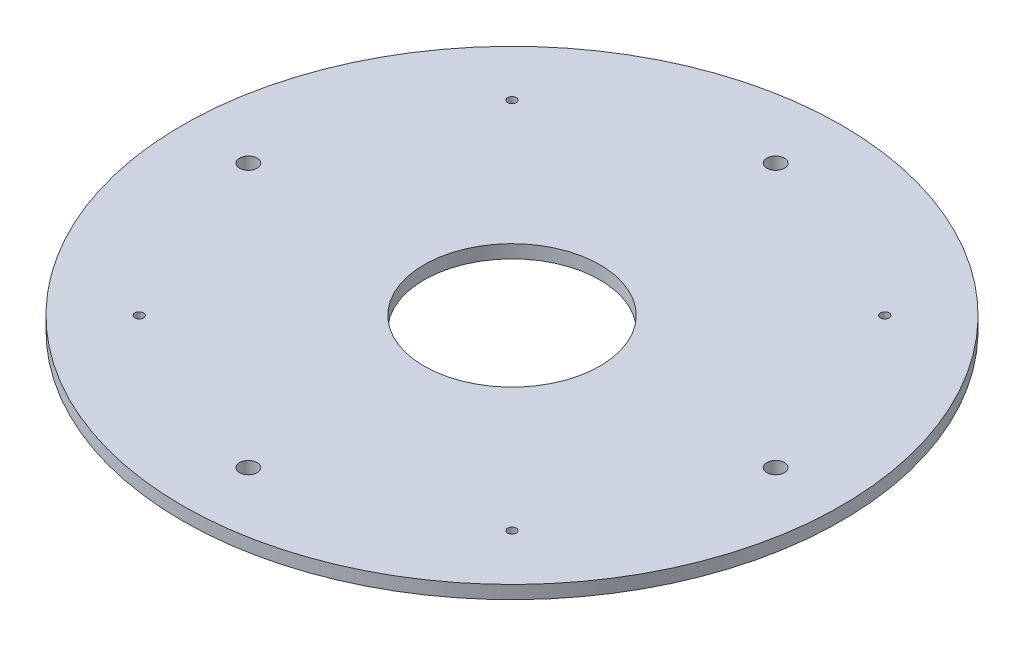
ISO-10303-21;
HEADER;
FILE_DESCRIPTION(('STEP AP214'),'2;1');
FILE_NAME('part.step','',(''),(''),'','','');
FILE_SCHEMA(('AUTOMOTIVE_DESIGN { 1 0 10303 214 1 1 1 1 }'));
ENDSEC;
DATA;
#1=APPLICATION_CONTEXT('core data for automotive mechanical design processes');
#2=APPLICATION_PROTOCOL_DEFINITION('international standard','automotive_design',2000,#1);
#3=PRODUCT_CONTEXT('',#1,'mechanical');
#4=PRODUCT('Part','Part','',(#3));
#5=PRODUCT_RELATED_PRODUCT_CATEGORY('part','',(#4));
#6=PRODUCT_DEFINITION_FORMATION('','',#4);
#7=PRODUCT_DEFINITION_CONTEXT('part definition',#1,'design');
#8=PRODUCT_DEFINITION('design','',#6,#7);
#9=PRODUCT_DEFINITION_SHAPE('','',#8);
#10=(LENGTH_UNIT() NAMED_UNIT(*) SI_UNIT(.MILLI.,.METRE.));
#11=(NAMED_UNIT(*) PLANE_ANGLE_UNIT() SI_UNIT($,.RADIAN.));
#12=(NAMED_UNIT(*) SI_UNIT($,.STERADIAN.) SOLID_ANGLE_UNIT());
#13=UNCERTAINTY_MEASURE_WITH_UNIT(LENGTH_MEASURE(1.E-05),#10,'distance_accuracy_value','');
#14=(GEOMETRIC_REPRESENTATION_CONTEXT(3) GLOBAL_UNCERTAINTY_ASSIGNED_CONTEXT((#13)) GLOBAL_UNIT_ASSIGNED_CONTEXT((#10,
#11,#12)) REPRESENTATION_CONTEXT('',''));
#15=CARTESIAN_POINT('',(0.,0.,0.));
#16=DIRECTION('',(0.,0.,1.));
#17=DIRECTION('',(1.,0.,0.));
#18=AXIS2_PLACEMENT_3D('',#15,#16,#17);
#19=CARTESIAN_POINT('',(0.,3.,0.));
#20=DIRECTION('',(0.,1.,0.));
#21=DIRECTION('',(0.,0.,1.));
#22=AXIS2_PLACEMENT_3D('',#19,#20,#21);
#23=PLANE('',#22);
#24=CARTESIAN_POINT('',(2.16836761125472E-13,3.,60.));
#25=DIRECTION('',(0.,1.,0.));
#26=DIRECTION('',(1.,0.,0.));
#27=AXIS2_PLACEMENT_3D('',#24,#25,#26);
#28=CIRCLE('',#27,2.);
#29=CARTESIAN_POINT('',(2.00000000000022,3.,60.));
#30=VERTEX_POINT('',#29);
#31=EDGE_CURVE('E72',#30,#30,#28,.T.);
#32=ORIENTED_EDGE('',*,*,#31,.F.);
#33=EDGE_LOOP('',(#32));
#34=FACE_BOUND('',#33,.T.);
#35=CARTESIAN_POINT('',(60.,3.,0.));
#36=DIRECTION('',(0.,1.,0.));
#37=DIRECTION('',(0.,0.,-1.));
#38=AXIS2_PLACEMENT_3D('',#35,#36,#37);
#39=CIRCLE('',#38,2.);
#40=CARTESIAN_POINT('',(60.,3.,-2.00000000000001));
#41=VERTEX_POINT('',#40);
#42=EDGE_CURVE('E128',#41,#41,#39,.T.);
#43=ORIENTED_EDGE('',*,*,#42,.F.);
#44=EDGE_LOOP('',(#43));
#45=FACE_BOUND('',#44,.T.);
#46=CARTESIAN_POINT('',(-6.35814521786648E-13,3.,-60.));
#47=DIRECTION('',(0.,1.,0.));
#48=DIRECTION('',(-1.,0.,0.));
#49=AXIS2_PLACEMENT_3D('',#46,#47,#48);
#50=CIRCLE('',#49,2.);
#51=CARTESIAN_POINT('',(-2.00000000000064,3.,-60.));
#52=VERTEX_POINT('',#51);
#53=EDGE_CURVE('E85',#52,#52,#50,.T.);
#54=ORIENTED_EDGE('',*,*,#53,.F.);
#55=EDGE_LOOP('',(#54));
#56=FACE_BOUND('',#55,.T.);
#57=CARTESIAN_POINT('',(-60.,3.,0.));
#58=DIRECTION('',(0.,1.,0.));
#59=DIRECTION('',(0.,0.,1.));
#60=AXIS2_PLACEMENT_3D('',#57,#58,#59);
#61=CIRCLE('',#60,2.);
#62=CARTESIAN_POINT('',(-60.,3.,2.00000000000001));
#63=VERTEX_POINT('',#62);
#64=EDGE_CURVE('E68',#63,#63,#61,.T.);
#65=ORIENTED_EDGE('',*,*,#64,.F.);
#66=EDGE_LOOP('',(#65));
#67=FACE_BOUND('',#66,.T.);
#68=CARTESIAN_POINT('',(-42.426406871193,3.,-42.4264068711927));
#69=DIRECTION('',(0.,1.,0.));
#70=DIRECTION('',(1.,0.,0.));
#71=AXIS2_PLACEMENT_3D('',#68,#69,#70);
#72=CIRCLE('',#71,0.999999999999998);
#73=CARTESIAN_POINT('',(-41.426406871193,3.,-42.4264068711927));
#74=VERTEX_POINT('',#73);
#75=EDGE_CURVE('E58',#74,#74,#72,.T.);
#76=ORIENTED_EDGE('',*,*,#75,.F.);
#77=EDGE_LOOP('',(#76));
#78=FACE_BOUND('',#77,.T.);
#79=CARTESIAN_POINT('',(-42.4264068711928,3.,42.4264068711928));
#80=DIRECTION('',(0.,1.,0.));
#81=DIRECTION('',(0.,0.,-1.));
#82=AXIS2_PLACEMENT_3D('',#79,#80,#81);
#83=CIRCLE('',#82,0.999999999999998);
#84=CARTESIAN_POINT('',(-42.4264068711928,3.,41.4264068711928));
#85=VERTEX_POINT('',#84);
#86=EDGE_CURVE('E89',#85,#85,#83,.T.);
#87=ORIENTED_EDGE('',*,*,#86,.F.);
#88=EDGE_LOOP('',(#87));
#89=FACE_BOUND('',#88,.T.);
#90=CARTESIAN_POINT('',(42.4264068711933,3.,42.4264068711924));
#91=DIRECTION('',(0.,1.,0.));
#92=DIRECTION('',(-1.,0.,0.));
#93=AXIS2_PLACEMENT_3D('',#90,#91,#92);
#94=CIRCLE('',#93,0.999999999999998);
#95=CARTESIAN_POINT('',(41.4264068711933,3.,42.4264068711924));
#96=VERTEX_POINT('',#95);
#97=EDGE_CURVE('E67',#96,#96,#94,.T.);
#98=ORIENTED_EDGE('',*,*,#97,.F.);
#99=EDGE_LOOP('',(#98));
#100=FACE_BOUND('',#99,.T.);
#101=CARTESIAN_POINT('',(42.4264068711928,3.,-42.4264068711928));
#102=DIRECTION('',(0.,1.,0.));
#103=DIRECTION('',(0.,0.,1.));
#104=AXIS2_PLACEMENT_3D('',#101,#102,#103);
#105=CIRCLE('',#104,0.999999999999998);
#106=CARTESIAN_POINT('',(42.4264068711928,3.,-41.4264068711928));
#107=VERTEX_POINT('',#106);
#108=EDGE_CURVE('E53',#107,#107,#105,.T.);
#109=ORIENTED_EDGE('',*,*,#108,.F.);
#110=EDGE_LOOP('',(#109));
#111=FACE_BOUND('',#110,.T.);
#112=CARTESIAN_POINT('',(0.,3.,0.));
#113=DIRECTION('',(0.,1.,0.));
#114=DIRECTION('',(0.,0.,1.));
#115=AXIS2_PLACEMENT_3D('',#112,#113,#114);
#116=CIRCLE('',#115,75.);
#117=CARTESIAN_POINT('',(0.,3.,75.));
#118=VERTEX_POINT('',#117);
#119=EDGE_CURVE('E10',#118,#118,#116,.T.);
#120=ORIENTED_EDGE('',*,*,#119,.T.);
#121=EDGE_LOOP('',(#120));
#122=FACE_BOUND('',#121,.T.);
#123=CARTESIAN_POINT('',(0.,3.,0.));
#124=DIRECTION('',(0.,1.,0.));
#125=DIRECTION('',(0.,0.,1.));
#126=AXIS2_PLACEMENT_3D('',#123,#124,#125);
#127=CIRCLE('',#126,20.);
#128=CARTESIAN_POINT('',(0.,3.,20.));
#129=VERTEX_POINT('',#128);
#130=EDGE_CURVE('E44',#129,#129,#127,.T.);
#131=ORIENTED_EDGE('',*,*,#130,.F.);
#132=EDGE_LOOP('',(#131));
#133=FACE_BOUND('',#132,.T.);
#134=ADVANCED_FACE('F31',(#34,#45,#56,#67,#78,#89,#100,#111,#122,#133),#23,.T.);
#135=CARTESIAN_POINT('',(0.,0.,0.));
#136=DIRECTION('',(0.,1.,0.));
#137=DIRECTION('',(0.,0.,1.));
#138=AXIS2_PLACEMENT_3D('',#135,#136,#137);
#139=PLANE('',#138);
#140=CARTESIAN_POINT('',(2.16836761125472E-13,0.,60.));
#141=DIRECTION('',(0.,1.,0.));
#142=DIRECTION('',(0.,0.,1.));
#143=AXIS2_PLACEMENT_3D('',#140,#141,#142);
#144=CIRCLE('',#143,2.);
#145=CARTESIAN_POINT('',(2.16836761125472E-13,0.,62.));
#146=VERTEX_POINT('',#145);
#147=EDGE_CURVE('E35',#146,#146,#144,.T.);
#148=ORIENTED_EDGE('',*,*,#147,.T.);
#149=EDGE_LOOP('',(#148));
#150=FACE_BOUND('',#149,.T.);
#151=CARTESIAN_POINT('',(60.,0.,0.));
#152=DIRECTION('',(0.,1.,0.));
#153=DIRECTION('',(0.,0.,1.));
#154=AXIS2_PLACEMENT_3D('',#151,#152,#153);
#155=CIRCLE('',#154,2.);
#156=CARTESIAN_POINT('',(60.,0.,2.));
#157=VERTEX_POINT('',#156);
#158=EDGE_CURVE('E71',#157,#157,#155,.T.);
#159=ORIENTED_EDGE('',*,*,#158,.T.);
#160=EDGE_LOOP('',(#159));
#161=FACE_BOUND('',#160,.T.);
#162=CARTESIAN_POINT('',(-6.35814521786648E-13,0.,-60.));
#163=DIRECTION('',(0.,1.,0.));
#164=DIRECTION('',(0.,0.,1.));
#165=AXIS2_PLACEMENT_3D('',#162,#163,#164);
#166=CIRCLE('',#165,2.);
#167=CARTESIAN_POINT('',(-6.35814521786648E-13,0.,-58.));
#168=VERTEX_POINT('',#167);
#169=EDGE_CURVE('E69',#168,#168,#166,.T.);
#170=ORIENTED_EDGE('',*,*,#169,.T.);
#171=EDGE_LOOP('',(#170));
#172=FACE_BOUND('',#171,.T.);
#173=CARTESIAN_POINT('',(-60.,0.,0.));
#174=DIRECTION('',(0.,1.,0.));
#175=DIRECTION('',(0.,0.,1.));
#176=AXIS2_PLACEMENT_3D('',#173,#174,#175);
#177=CIRCLE('',#176,2.);
#178=CARTESIAN_POINT('',(-60.,0.,2.00000000000001));
#179=VERTEX_POINT('',#178);
#180=EDGE_CURVE('E64',#179,#179,#177,.T.);
#181=ORIENTED_EDGE('',*,*,#180,.T.);
#182=EDGE_LOOP('',(#181));
#183=FACE_BOUND('',#182,.T.);
#184=CARTESIAN_POINT('',(-42.426406871193,0.,-42.4264068711927));
#185=DIRECTION('',(0.,1.,0.));
#186=DIRECTION('',(0.,0.,1.));
#187=AXIS2_PLACEMENT_3D('',#184,#185,#186);
#188=CIRCLE('',#187,0.999999999999998);
#189=CARTESIAN_POINT('',(-42.426406871193,0.,-41.4264068711927));
#190=VERTEX_POINT('',#189);
#191=EDGE_CURVE('E61',#190,#190,#188,.T.);
#192=ORIENTED_EDGE('',*,*,#191,.T.);
#193=EDGE_LOOP('',(#192));
#194=FACE_BOUND('',#193,.T.);
#195=CARTESIAN_POINT('',(-42.4264068711928,0.,42.4264068711928));
#196=DIRECTION('',(0.,1.,0.));
#197=DIRECTION('',(0.,0.,1.));
#198=AXIS2_PLACEMENT_3D('',#195,#196,#197);
#199=CIRCLE('',#198,0.999999999999998);
#200=CARTESIAN_POINT('',(-42.4264068711928,0.,43.4264068711928));
#201=VERTEX_POINT('',#200);
#202=EDGE_CURVE('E57',#201,#201,#199,.T.);
#203=ORIENTED_EDGE('',*,*,#202,.T.);
#204=EDGE_LOOP('',(#203));
#205=FACE_BOUND('',#204,.T.);
#206=CARTESIAN_POINT('',(42.4264068711933,0.,42.4264068711924));
#207=DIRECTION('',(0.,1.,0.));
#208=DIRECTION('',(0.,0.,1.));
#209=AXIS2_PLACEMENT_3D('',#206,#207,#208);
#210=CIRCLE('',#209,0.999999999999998);
#211=CARTESIAN_POINT('',(42.4264068711933,0.,43.4264068711924));
#212=VERTEX_POINT('',#211);
#213=EDGE_CURVE('E54',#212,#212,#210,.T.);
#214=ORIENTED_EDGE('',*,*,#213,.T.);
#215=EDGE_LOOP('',(#214));
#216=FACE_BOUND('',#215,.T.);
#217=CARTESIAN_POINT('',(42.4264068711928,0.,-42.4264068711928));
#218=DIRECTION('',(0.,1.,0.));
#219=DIRECTION('',(0.,0.,1.));
#220=AXIS2_PLACEMENT_3D('',#217,#218,#219);
#221=CIRCLE('',#220,0.999999999999998);
#222=CARTESIAN_POINT('',(42.4264068711928,0.,-41.4264068711928));
#223=VERTEX_POINT('',#222);
#224=EDGE_CURVE('E50',#223,#223,#221,.T.);
#225=ORIENTED_EDGE('',*,*,#224,.T.);
#226=EDGE_LOOP('',(#225));
#227=FACE_BOUND('',#226,.T.);
#228=CARTESIAN_POINT('',(0.,0.,0.));
#229=DIRECTION('',(0.,1.,0.));
#230=DIRECTION('',(0.,0.,1.));
#231=AXIS2_PLACEMENT_3D('',#228,#229,#230);
#232=CIRCLE('',#231,75.);
#233=CARTESIAN_POINT('',(0.,0.,75.));
#234=VERTEX_POINT('',#233);
#235=EDGE_CURVE('E39',#234,#234,#232,.T.);
#236=ORIENTED_EDGE('',*,*,#235,.F.);
#237=EDGE_LOOP('',(#236));
#238=FACE_BOUND('',#237,.T.);
#239=CARTESIAN_POINT('',(0.,0.,0.));
#240=DIRECTION('',(0.,1.,0.));
#241=DIRECTION('',(0.,0.,1.));
#242=AXIS2_PLACEMENT_3D('',#239,#240,#241);
#243=CIRCLE('',#242,20.);
#244=CARTESIAN_POINT('',(0.,0.,20.));
#245=VERTEX_POINT('',#244);
#246=EDGE_CURVE('E47',#245,#245,#243,.T.);
#247=ORIENTED_EDGE('',*,*,#246,.T.);
#248=EDGE_LOOP('',(#247));
#249=FACE_BOUND('',#248,.T.);
#250=ADVANCED_FACE('F101',(#150,#161,#172,#183,#194,#205,#216,#227,#238,#249),#139,.F.);
#251=CARTESIAN_POINT('',(0.,3.,0.));
#252=DIRECTION('',(0.,-1.,0.));
#253=DIRECTION('',(0.,0.,-1.));
#254=AXIS2_PLACEMENT_3D('',#251,#252,#253);
#255=CYLINDRICAL_SURFACE('',#254,75.);
#256=ORIENTED_EDGE('',*,*,#119,.F.);
#257=EDGE_LOOP('',(#256));
#258=FACE_BOUND('',#257,.T.);
#259=ORIENTED_EDGE('',*,*,#235,.T.);
#260=EDGE_LOOP('',(#259));
#261=FACE_BOUND('',#260,.T.);
#262=ADVANCED_FACE('F33',(#258,#261),#255,.T.);
#263=CARTESIAN_POINT('',(0.,3.,0.));
#264=DIRECTION('',(0.,-1.,0.));
#265=DIRECTION('',(0.,0.,-1.));
#266=AXIS2_PLACEMENT_3D('',#263,#264,#265);
#267=CYLINDRICAL_SURFACE('',#266,20.);
#268=ORIENTED_EDGE('',*,*,#130,.T.);
#269=EDGE_LOOP('',(#268));
#270=FACE_BOUND('',#269,.T.);
#271=ORIENTED_EDGE('',*,*,#246,.F.);
#272=EDGE_LOOP('',(#271));
#273=FACE_BOUND('',#272,.T.);
#274=ADVANCED_FACE('F103',(#270,#273),#267,.F.);
#275=CARTESIAN_POINT('',(42.4264068711928,-7.,-42.4264068711928));
#276=DIRECTION('',(0.,1.,0.));
#277=DIRECTION('',(0.,0.,1.));
#278=AXIS2_PLACEMENT_3D('',#275,#276,#277);
#279=CYLINDRICAL_SURFACE('',#278,0.999999999999998);
#280=ORIENTED_EDGE('',*,*,#108,.T.);
#281=EDGE_LOOP('',(#280));
#282=FACE_BOUND('',#281,.T.);
#283=ORIENTED_EDGE('',*,*,#224,.F.);
#284=EDGE_LOOP('',(#283));
#285=FACE_BOUND('',#284,.T.);
#286=ADVANCED_FACE('F105',(#282,#285),#279,.F.);
#287=CARTESIAN_POINT('',(42.4264068711933,-7.,42.4264068711924));
#288=DIRECTION('',(0.,1.,0.));
#289=DIRECTION('',(0.,0.,1.));
#290=AXIS2_PLACEMENT_3D('',#287,#288,#289);
#291=CYLINDRICAL_SURFACE('',#290,0.999999999999998);
#292=ORIENTED_EDGE('',*,*,#97,.T.);
#293=EDGE_LOOP('',(#292));
#294=FACE_BOUND('',#293,.T.);
#295=ORIENTED_EDGE('',*,*,#213,.F.);
#296=EDGE_LOOP('',(#295));
#297=FACE_BOUND('',#296,.T.);
#298=ADVANCED_FACE('F111',(#294,#297),#291,.F.);
#299=CARTESIAN_POINT('',(-42.4264068711928,-7.,42.4264068711928));
#300=DIRECTION('',(0.,1.,0.));
#301=DIRECTION('',(0.,0.,1.));
#302=AXIS2_PLACEMENT_3D('',#299,#300,#301);
#303=CYLINDRICAL_SURFACE('',#302,0.999999999999998);
#304=ORIENTED_EDGE('',*,*,#86,.T.);
#305=EDGE_LOOP('',(#304));
#306=FACE_BOUND('',#305,.T.);
#307=ORIENTED_EDGE('',*,*,#202,.F.);
#308=EDGE_LOOP('',(#307));
#309=FACE_BOUND('',#308,.T.);
#310=ADVANCED_FACE('F150',(#306,#309),#303,.F.);
#311=CARTESIAN_POINT('',(-42.426406871193,-7.,-42.4264068711927));
#312=DIRECTION('',(0.,1.,0.));
#313=DIRECTION('',(0.,0.,1.));
#314=AXIS2_PLACEMENT_3D('',#311,#312,#313);
#315=CYLINDRICAL_SURFACE('',#314,0.999999999999998);
#316=ORIENTED_EDGE('',*,*,#75,.T.);
#317=EDGE_LOOP('',(#316));
#318=FACE_BOUND('',#317,.T.);
#319=ORIENTED_EDGE('',*,*,#191,.F.);
#320=EDGE_LOOP('',(#319));
#321=FACE_BOUND('',#320,.T.);
#322=ADVANCED_FACE('F157',(#318,#321),#315,.F.);
#323=CARTESIAN_POINT('',(-60.,-7.,0.));
#324=DIRECTION('',(0.,1.,0.));
#325=DIRECTION('',(0.,0.,1.));
#326=AXIS2_PLACEMENT_3D('',#323,#324,#325);
#327=CYLINDRICAL_SURFACE('',#326,2.);
#328=ORIENTED_EDGE('',*,*,#64,.T.);
#329=EDGE_LOOP('',(#328));
#330=FACE_BOUND('',#329,.T.);
#331=ORIENTED_EDGE('',*,*,#180,.F.);
#332=EDGE_LOOP('',(#331));
#333=FACE_BOUND('',#332,.T.);
#334=ADVANCED_FACE('F163',(#330,#333),#327,.F.);
#335=CARTESIAN_POINT('',(-6.35814521786648E-13,-7.,-60.));
#336=DIRECTION('',(0.,1.,0.));
#337=DIRECTION('',(0.,0.,1.));
#338=AXIS2_PLACEMENT_3D('',#335,#336,#337);
#339=CYLINDRICAL_SURFACE('',#338,2.);
#340=ORIENTED_EDGE('',*,*,#53,.T.);
#341=EDGE_LOOP('',(#340));
#342=FACE_BOUND('',#341,.T.);
#343=ORIENTED_EDGE('',*,*,#169,.F.);
#344=EDGE_LOOP('',(#343));
#345=FACE_BOUND('',#344,.T.);
#346=ADVANCED_FACE('F167',(#342,#345),#339,.F.);
#347=CARTESIAN_POINT('',(60.,-7.,0.));
#348=DIRECTION('',(0.,1.,0.));
#349=DIRECTION('',(0.,0.,1.));
#350=AXIS2_PLACEMENT_3D('',#347,#348,#349);
#351=CYLINDRICAL_SURFACE('',#350,2.);
#352=ORIENTED_EDGE('',*,*,#42,.T.);
#353=EDGE_LOOP('',(#352));
#354=FACE_BOUND('',#353,.T.);
#355=ORIENTED_EDGE('',*,*,#158,.F.);
#356=EDGE_LOOP('',(#355));
#357=FACE_BOUND('',#356,.T.);
#358=ADVANCED_FACE('F170',(#354,#357),#351,.F.);
#359=CARTESIAN_POINT('',(2.16836761125472E-13,-7.,60.));
#360=DIRECTION('',(0.,1.,0.));
#361=DIRECTION('',(0.,0.,1.));
#362=AXIS2_PLACEMENT_3D('',#359,#360,#361);
#363=CYLINDRICAL_SURFACE('',#362,2.);
#364=ORIENTED_EDGE('',*,*,#31,.T.);
#365=EDGE_LOOP('',(#364));
#366=FACE_BOUND('',#365,.T.);
#367=ORIENTED_EDGE('',*,*,#147,.F.);
#368=EDGE_LOOP('',(#367));
#369=FACE_BOUND('',#368,.T.);
#370=ADVANCED_FACE('F174',(#366,#369),#363,.F.);
#371=CLOSED_SHELL('',(#134,#250,#262,#274,#286,#298,#310,#322,#334,#346,#358,#370));
#372=MANIFOLD_SOLID_BREP('B2',#371);
#373=ADVANCED_BREP_SHAPE_REPRESENTATION('',(#18,#372),#14);
#374=SHAPE_DEFINITION_REPRESENTATION(#9,#373);
ENDSEC;
END-ISO-10303-21;
